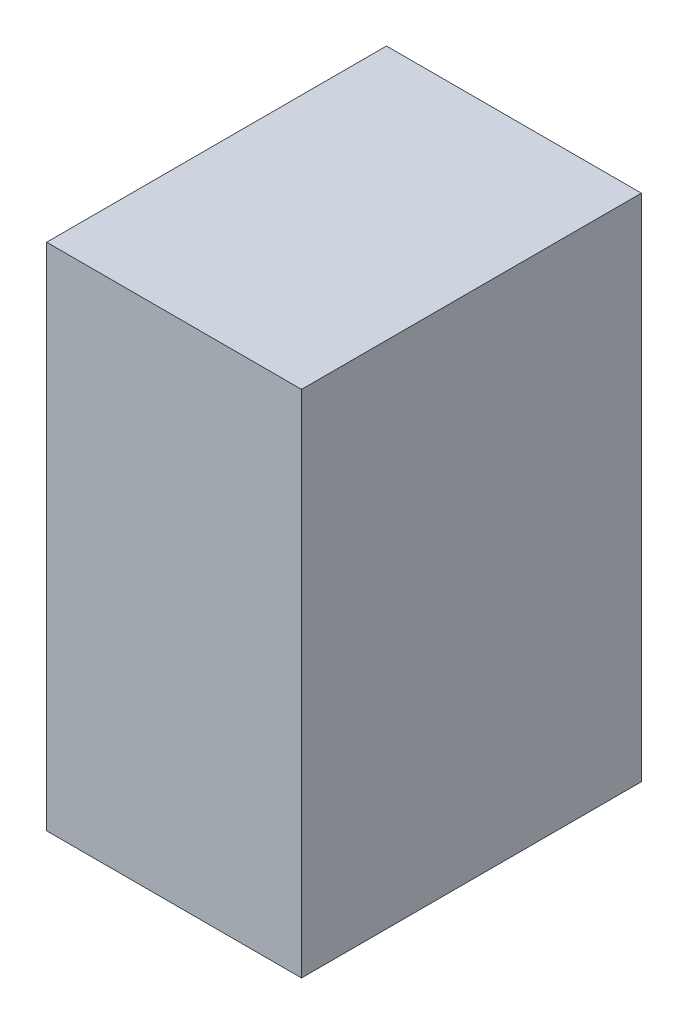
ISO-10303-21;
HEADER;
FILE_DESCRIPTION(('STEP AP214'),'2;1');
FILE_NAME('part.step','',(''),(''),'','','');
FILE_SCHEMA(('AUTOMOTIVE_DESIGN { 1 0 10303 214 1 1 1 1 }'));
ENDSEC;
DATA;
#1=APPLICATION_CONTEXT('core data for automotive mechanical design processes');
#2=APPLICATION_PROTOCOL_DEFINITION('international standard','automotive_design',2000,#1);
#3=PRODUCT_CONTEXT('',#1,'mechanical');
#4=PRODUCT('Part','Part','',(#3));
#5=PRODUCT_RELATED_PRODUCT_CATEGORY('part','',(#4));
#6=PRODUCT_DEFINITION_FORMATION('','',#4);
#7=PRODUCT_DEFINITION_CONTEXT('part definition',#1,'design');
#8=PRODUCT_DEFINITION('design','',#6,#7);
#9=PRODUCT_DEFINITION_SHAPE('','',#8);
#10=(LENGTH_UNIT() NAMED_UNIT(*) SI_UNIT(.MILLI.,.METRE.));
#11=(NAMED_UNIT(*) PLANE_ANGLE_UNIT() SI_UNIT($,.RADIAN.));
#12=(NAMED_UNIT(*) SI_UNIT($,.STERADIAN.) SOLID_ANGLE_UNIT());
#13=UNCERTAINTY_MEASURE_WITH_UNIT(LENGTH_MEASURE(1.E-05),#10,'distance_accuracy_value','');
#14=(GEOMETRIC_REPRESENTATION_CONTEXT(3) GLOBAL_UNCERTAINTY_ASSIGNED_CONTEXT((#13)) GLOBAL_UNIT_ASSIGNED_CONTEXT((#10,
#11,#12)) REPRESENTATION_CONTEXT('',''));
#15=CARTESIAN_POINT('',(0.,0.,0.));
#16=DIRECTION('',(0.,0.,1.));
#17=DIRECTION('',(1.,0.,0.));
#18=AXIS2_PLACEMENT_3D('',#15,#16,#17);
#19=CARTESIAN_POINT('',(3.,-6.,8.));
#20=DIRECTION('',(-1.,0.,0.));
#21=DIRECTION('',(0.,0.,1.));
#22=AXIS2_PLACEMENT_3D('',#19,#20,#21);
#23=PLANE('',#22);
#24=DIRECTION('',(0.,1.,0.));
#25=VECTOR('',#24,1.);
#26=CARTESIAN_POINT('',(3.,-6.,0.));
#27=LINE('',#26,#25);
#28=CARTESIAN_POINT('',(3.,-6.,0.));
#29=VERTEX_POINT('',#28);
#30=CARTESIAN_POINT('',(3.,6.,0.));
#31=VERTEX_POINT('',#30);
#32=EDGE_CURVE('E113',#29,#31,#27,.T.);
#33=ORIENTED_EDGE('',*,*,#32,.T.);
#34=DIRECTION('',(0.,0.,-1.));
#35=VECTOR('',#34,1.);
#36=CARTESIAN_POINT('',(3.,6.,8.));
#37=LINE('',#36,#35);
#38=CARTESIAN_POINT('',(3.,6.,8.));
#39=VERTEX_POINT('',#38);
#40=EDGE_CURVE('E11',#39,#31,#37,.T.);
#41=ORIENTED_EDGE('',*,*,#40,.F.);
#42=DIRECTION('',(0.,1.,0.));
#43=VECTOR('',#42,1.);
#44=CARTESIAN_POINT('',(3.,-6.,8.));
#45=LINE('',#44,#43);
#46=CARTESIAN_POINT('',(3.,-6.,8.));
#47=VERTEX_POINT('',#46);
#48=EDGE_CURVE('E97',#47,#39,#45,.T.);
#49=ORIENTED_EDGE('',*,*,#48,.F.);
#50=DIRECTION('',(0.,0.,-1.));
#51=VECTOR('',#50,1.);
#52=CARTESIAN_POINT('',(3.,-6.,8.));
#53=LINE('',#52,#51);
#54=EDGE_CURVE('E109',#47,#29,#53,.T.);
#55=ORIENTED_EDGE('',*,*,#54,.T.);
#56=EDGE_LOOP('',(#33,#41,#49,#55));
#57=FACE_BOUND('',#56,.T.);
#58=ADVANCED_FACE('F45',(#57),#23,.F.);
#59=CARTESIAN_POINT('',(-3.,6.,8.));
#60=DIRECTION('',(0.,-1.,0.));
#61=DIRECTION('',(0.,0.,-1.));
#62=AXIS2_PLACEMENT_3D('',#59,#60,#61);
#63=PLANE('',#62);
#64=DIRECTION('',(-1.,0.,0.));
#65=VECTOR('',#64,1.);
#66=CARTESIAN_POINT('',(-3.,6.,0.));
#67=LINE('',#66,#65);
#68=CARTESIAN_POINT('',(-3.,6.,0.));
#69=VERTEX_POINT('',#68);
#70=EDGE_CURVE('E102',#31,#69,#67,.T.);
#71=ORIENTED_EDGE('',*,*,#70,.T.);
#72=DIRECTION('',(0.,0.,-1.));
#73=VECTOR('',#72,1.);
#74=CARTESIAN_POINT('',(-3.,6.,8.));
#75=LINE('',#74,#73);
#76=CARTESIAN_POINT('',(-3.,6.,8.));
#77=VERTEX_POINT('',#76);
#78=EDGE_CURVE('E54',#77,#69,#75,.T.);
#79=ORIENTED_EDGE('',*,*,#78,.F.);
#80=DIRECTION('',(-1.,0.,0.));
#81=VECTOR('',#80,1.);
#82=CARTESIAN_POINT('',(-3.,6.,8.));
#83=LINE('',#82,#81);
#84=EDGE_CURVE('E92',#39,#77,#83,.T.);
#85=ORIENTED_EDGE('',*,*,#84,.F.);
#86=ORIENTED_EDGE('',*,*,#40,.T.);
#87=EDGE_LOOP('',(#71,#79,#85,#86));
#88=FACE_BOUND('',#87,.T.);
#89=ADVANCED_FACE('F101',(#88),#63,.F.);
#90=CARTESIAN_POINT('',(-3.,-6.,8.));
#91=DIRECTION('',(1.,0.,0.));
#92=DIRECTION('',(0.,0.,-1.));
#93=AXIS2_PLACEMENT_3D('',#90,#91,#92);
#94=PLANE('',#93);
#95=DIRECTION('',(0.,-1.,0.));
#96=VECTOR('',#95,1.);
#97=CARTESIAN_POINT('',(-3.,-6.,0.));
#98=LINE('',#97,#96);
#99=CARTESIAN_POINT('',(-3.,-6.,0.));
#100=VERTEX_POINT('',#99);
#101=EDGE_CURVE('E79',#69,#100,#98,.T.);
#102=ORIENTED_EDGE('',*,*,#101,.T.);
#103=DIRECTION('',(0.,0.,-1.));
#104=VECTOR('',#103,1.);
#105=CARTESIAN_POINT('',(-3.,-6.,8.));
#106=LINE('',#105,#104);
#107=CARTESIAN_POINT('',(-3.,-6.,8.));
#108=VERTEX_POINT('',#107);
#109=EDGE_CURVE('E104',#108,#100,#106,.T.);
#110=ORIENTED_EDGE('',*,*,#109,.F.);
#111=DIRECTION('',(0.,-1.,0.));
#112=VECTOR('',#111,1.);
#113=CARTESIAN_POINT('',(-3.,-6.,8.));
#114=LINE('',#113,#112);
#115=EDGE_CURVE('E95',#77,#108,#114,.T.);
#116=ORIENTED_EDGE('',*,*,#115,.F.);
#117=ORIENTED_EDGE('',*,*,#78,.T.);
#118=EDGE_LOOP('',(#102,#110,#116,#117));
#119=FACE_BOUND('',#118,.T.);
#120=ADVANCED_FACE('F105',(#119),#94,.F.);
#121=CARTESIAN_POINT('',(-3.,-6.,8.));
#122=DIRECTION('',(0.,1.,0.));
#123=DIRECTION('',(0.,0.,1.));
#124=AXIS2_PLACEMENT_3D('',#121,#122,#123);
#125=PLANE('',#124);
#126=DIRECTION('',(1.,0.,0.));
#127=VECTOR('',#126,1.);
#128=CARTESIAN_POINT('',(-3.,-6.,0.));
#129=LINE('',#128,#127);
#130=EDGE_CURVE('E85',#100,#29,#129,.T.);
#131=ORIENTED_EDGE('',*,*,#130,.T.);
#132=ORIENTED_EDGE('',*,*,#54,.F.);
#133=DIRECTION('',(1.,0.,0.));
#134=VECTOR('',#133,1.);
#135=CARTESIAN_POINT('',(-3.,-6.,8.));
#136=LINE('',#135,#134);
#137=EDGE_CURVE('E62',#108,#47,#136,.T.);
#138=ORIENTED_EDGE('',*,*,#137,.F.);
#139=ORIENTED_EDGE('',*,*,#109,.T.);
#140=EDGE_LOOP('',(#131,#132,#138,#139));
#141=FACE_BOUND('',#140,.T.);
#142=ADVANCED_FACE('F126',(#141),#125,.F.);
#143=CARTESIAN_POINT('',(0.,0.,8.));
#144=DIRECTION('',(0.,0.,-1.));
#145=DIRECTION('',(-1.,0.,0.));
#146=AXIS2_PLACEMENT_3D('',#143,#144,#145);
#147=PLANE('',#146);
#148=ORIENTED_EDGE('',*,*,#48,.T.);
#149=ORIENTED_EDGE('',*,*,#84,.T.);
#150=ORIENTED_EDGE('',*,*,#115,.T.);
#151=ORIENTED_EDGE('',*,*,#137,.T.);
#152=EDGE_LOOP('',(#148,#149,#150,#151));
#153=FACE_BOUND('',#152,.T.);
#154=ADVANCED_FACE('F93',(#153),#147,.F.);
#155=CARTESIAN_POINT('',(0.,0.,0.));
#156=DIRECTION('',(0.,0.,-1.));
#157=DIRECTION('',(-1.,0.,0.));
#158=AXIS2_PLACEMENT_3D('',#155,#156,#157);
#159=PLANE('',#158);
#160=ORIENTED_EDGE('',*,*,#32,.F.);
#161=ORIENTED_EDGE('',*,*,#130,.F.);
#162=ORIENTED_EDGE('',*,*,#101,.F.);
#163=ORIENTED_EDGE('',*,*,#70,.F.);
#164=EDGE_LOOP('',(#160,#161,#162,#163));
#165=FACE_BOUND('',#164,.T.);
#166=ADVANCED_FACE('F129',(#165),#159,.T.);
#167=CLOSED_SHELL('',(#58,#89,#120,#142,#154,#166));
#168=MANIFOLD_SOLID_BREP('B2',#167);
#169=ADVANCED_BREP_SHAPE_REPRESENTATION('',(#18,#168),#14);
#170=SHAPE_DEFINITION_REPRESENTATION(#9,#169);
ENDSEC;
END-ISO-10303-21;
